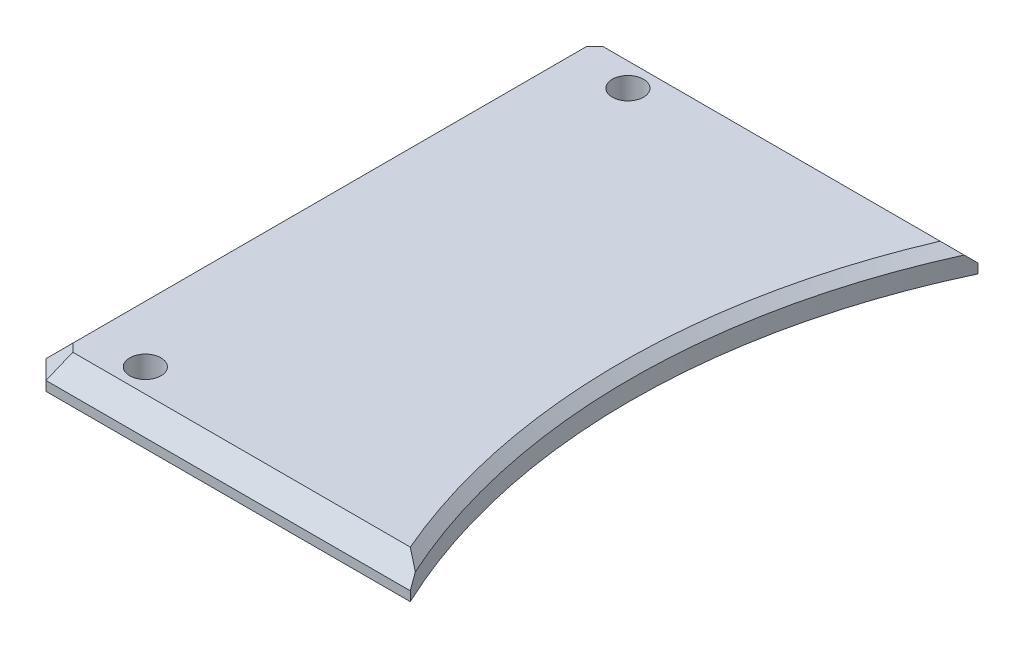
ISO-10303-21;
HEADER;
FILE_DESCRIPTION(('STEP AP214'),'2;1');
FILE_NAME('part.step','',(''),(''),'','','');
FILE_SCHEMA(('AUTOMOTIVE_DESIGN { 1 0 10303 214 1 1 1 1 }'));
ENDSEC;
DATA;
#1=APPLICATION_CONTEXT('core data for automotive mechanical design processes');
#2=APPLICATION_PROTOCOL_DEFINITION('international standard','automotive_design',2000,#1);
#3=PRODUCT_CONTEXT('',#1,'mechanical');
#4=PRODUCT('Part','Part','',(#3));
#5=PRODUCT_RELATED_PRODUCT_CATEGORY('part','',(#4));
#6=PRODUCT_DEFINITION_FORMATION('','',#4);
#7=PRODUCT_DEFINITION_CONTEXT('part definition',#1,'design');
#8=PRODUCT_DEFINITION('design','',#6,#7);
#9=PRODUCT_DEFINITION_SHAPE('','',#8);
#10=(LENGTH_UNIT() NAMED_UNIT(*) SI_UNIT(.MILLI.,.METRE.));
#11=(NAMED_UNIT(*) PLANE_ANGLE_UNIT() SI_UNIT($,.RADIAN.));
#12=(NAMED_UNIT(*) SI_UNIT($,.STERADIAN.) SOLID_ANGLE_UNIT());
#13=UNCERTAINTY_MEASURE_WITH_UNIT(LENGTH_MEASURE(1.E-05),#10,'distance_accuracy_value','');
#14=(GEOMETRIC_REPRESENTATION_CONTEXT(3) GLOBAL_UNCERTAINTY_ASSIGNED_CONTEXT((#13)) GLOBAL_UNIT_ASSIGNED_CONTEXT((#10,
#11,#12)) REPRESENTATION_CONTEXT('',''));
#15=CARTESIAN_POINT('',(0.,0.,0.));
#16=DIRECTION('',(0.,0.,1.));
#17=DIRECTION('',(1.,0.,0.));
#18=AXIS2_PLACEMENT_3D('',#15,#16,#17);
#19=CARTESIAN_POINT('',(83.4955532033676,-3.,0.));
#20=DIRECTION('',(0.,1.,0.));
#21=DIRECTION('',(0.,0.,1.));
#22=AXIS2_PLACEMENT_3D('',#19,#20,#21);
#23=CYLINDRICAL_SURFACE('',#22,70.);
#24=CARTESIAN_POINT('',(83.4955532033676,28.0000000000001,0.));
#25=DIRECTION('',(0.,-0.707106781186546,0.707106781186549));
#26=DIRECTION('',(0.,0.707106781186549,0.707106781186546));
#27=AXIS2_PLACEMENT_3D('',#24,#25,#26);
#28=ELLIPSE('',#27,98.9949493661168,70.);
#29=CARTESIAN_POINT('',(20.25,-2.00000000000001,-30.));
#30=VERTEX_POINT('',#29);
#31=CARTESIAN_POINT('',(19.7852714585817,-1.00000000000001,-29.));
#32=VERTEX_POINT('',#31);
#33=EDGE_CURVE('E174',#30,#32,#28,.F.);
#34=ORIENTED_EDGE('',*,*,#33,.T.);
#35=CARTESIAN_POINT('',(83.4955532033676,-1.,0.));
#36=DIRECTION('',(0.,1.,0.));
#37=DIRECTION('',(0.,0.,1.));
#38=AXIS2_PLACEMENT_3D('',#35,#36,#37);
#39=CIRCLE('',#38,70.);
#40=CARTESIAN_POINT('',(19.7852714585817,-1.,29.));
#41=VERTEX_POINT('',#40);
#42=EDGE_CURVE('E45',#32,#41,#39,.T.);
#43=ORIENTED_EDGE('',*,*,#42,.T.);
#44=CARTESIAN_POINT('',(83.4955532033676,28.0000000000001,0.));
#45=DIRECTION('',(0.,-0.707106781186546,-0.707106781186549));
#46=DIRECTION('',(0.,0.707106781186549,-0.707106781186546));
#47=AXIS2_PLACEMENT_3D('',#44,#45,#46);
#48=ELLIPSE('',#47,98.9949493661168,70.);
#49=CARTESIAN_POINT('',(20.25,-2.00000000000001,30.));
#50=VERTEX_POINT('',#49);
#51=EDGE_CURVE('E172',#41,#50,#48,.F.);
#52=ORIENTED_EDGE('',*,*,#51,.T.);
#53=DIRECTION('',(0.,1.,0.));
#54=VECTOR('',#53,1.);
#55=CARTESIAN_POINT('',(20.25,-3.,30.));
#56=LINE('',#55,#54);
#57=CARTESIAN_POINT('',(20.25,-3.,30.));
#58=VERTEX_POINT('',#57);
#59=EDGE_CURVE('E122',#58,#50,#56,.T.);
#60=ORIENTED_EDGE('',*,*,#59,.F.);
#61=CARTESIAN_POINT('',(83.4955532033676,-3.,0.));
#62=DIRECTION('',(0.,-1.,0.));
#63=DIRECTION('',(0.,0.,1.));
#64=AXIS2_PLACEMENT_3D('',#61,#62,#63);
#65=CIRCLE('',#64,70.);
#66=CARTESIAN_POINT('',(20.25,-3.,-30.));
#67=VERTEX_POINT('',#66);
#68=EDGE_CURVE('E129',#58,#67,#65,.T.);
#69=ORIENTED_EDGE('',*,*,#68,.T.);
#70=DIRECTION('',(0.,1.,0.));
#71=VECTOR('',#70,1.);
#72=CARTESIAN_POINT('',(20.25,-3.,-30.));
#73=LINE('',#72,#71);
#74=EDGE_CURVE('E113',#67,#30,#73,.T.);
#75=ORIENTED_EDGE('',*,*,#74,.T.);
#76=EDGE_LOOP('',(#34,#43,#52,#60,#69,#75));
#77=FACE_BOUND('',#76,.T.);
#78=ADVANCED_FACE('F33',(#77),#23,.F.);
#79=CARTESIAN_POINT('',(-20.25,-3.,30.));
#80=DIRECTION('',(0.,0.,1.));
#81=DIRECTION('',(1.,0.,0.));
#82=AXIS2_PLACEMENT_3D('',#79,#80,#81);
#83=PLANE('',#82);
#84=ORIENTED_EDGE('',*,*,#59,.T.);
#85=DIRECTION('',(-1.,0.,0.));
#86=VECTOR('',#85,1.);
#87=CARTESIAN_POINT('',(-20.25,-2.00000000000001,30.));
#88=LINE('',#87,#86);
#89=CARTESIAN_POINT('',(-18.25,-2.00000000000001,30.));
#90=VERTEX_POINT('',#89);
#91=EDGE_CURVE('E178',#50,#90,#88,.T.);
#92=ORIENTED_EDGE('',*,*,#91,.T.);
#93=DIRECTION('',(0.,-1.,0.));
#94=VECTOR('',#93,1.);
#95=CARTESIAN_POINT('',(-18.25,-3.,30.));
#96=LINE('',#95,#94);
#97=CARTESIAN_POINT('',(-18.25,-3.,30.));
#98=VERTEX_POINT('',#97);
#99=EDGE_CURVE('E153',#90,#98,#96,.T.);
#100=ORIENTED_EDGE('',*,*,#99,.T.);
#101=DIRECTION('',(1.,0.,0.));
#102=VECTOR('',#101,1.);
#103=CARTESIAN_POINT('',(-20.25,-3.,30.));
#104=LINE('',#103,#102);
#105=EDGE_CURVE('E123',#98,#58,#104,.T.);
#106=ORIENTED_EDGE('',*,*,#105,.T.);
#107=EDGE_LOOP('',(#84,#92,#100,#106));
#108=FACE_BOUND('',#107,.T.);
#109=ADVANCED_FACE('F232',(#108),#83,.T.);
#110=CARTESIAN_POINT('',(-20.25,-3.,30.));
#111=DIRECTION('',(-1.,0.,0.));
#112=DIRECTION('',(0.,0.,1.));
#113=AXIS2_PLACEMENT_3D('',#110,#111,#112);
#114=PLANE('',#113);
#115=DIRECTION('',(0.,1.,0.));
#116=VECTOR('',#115,1.);
#117=CARTESIAN_POINT('',(-20.25,-3.,28.));
#118=LINE('',#117,#116);
#119=CARTESIAN_POINT('',(-20.25,-3.,28.));
#120=VERTEX_POINT('',#119);
#121=CARTESIAN_POINT('',(-20.25,-2.00000000000001,28.));
#122=VERTEX_POINT('',#121);
#123=EDGE_CURVE('E150',#120,#122,#118,.T.);
#124=ORIENTED_EDGE('',*,*,#123,.T.);
#125=DIRECTION('',(0.,0.,-1.));
#126=VECTOR('',#125,1.);
#127=CARTESIAN_POINT('',(-20.25,-2.00000000000001,30.));
#128=LINE('',#127,#126);
#129=CARTESIAN_POINT('',(-20.25,-2.00000000000001,-28.));
#130=VERTEX_POINT('',#129);
#131=EDGE_CURVE('E182',#122,#130,#128,.T.);
#132=ORIENTED_EDGE('',*,*,#131,.T.);
#133=DIRECTION('',(0.,-1.,0.));
#134=VECTOR('',#133,1.);
#135=CARTESIAN_POINT('',(-20.25,-3.,-28.));
#136=LINE('',#135,#134);
#137=CARTESIAN_POINT('',(-20.25,-3.,-28.));
#138=VERTEX_POINT('',#137);
#139=EDGE_CURVE('E147',#130,#138,#136,.T.);
#140=ORIENTED_EDGE('',*,*,#139,.T.);
#141=DIRECTION('',(0.,0.,1.));
#142=VECTOR('',#141,1.);
#143=CARTESIAN_POINT('',(-20.25,-3.,30.));
#144=LINE('',#143,#142);
#145=EDGE_CURVE('E133',#138,#120,#144,.T.);
#146=ORIENTED_EDGE('',*,*,#145,.T.);
#147=EDGE_LOOP('',(#124,#132,#140,#146));
#148=FACE_BOUND('',#147,.T.);
#149=ADVANCED_FACE('F239',(#148),#114,.T.);
#150=CARTESIAN_POINT('',(-20.25,-3.,-30.));
#151=DIRECTION('',(0.,0.,-1.));
#152=DIRECTION('',(-1.,0.,0.));
#153=AXIS2_PLACEMENT_3D('',#150,#151,#152);
#154=PLANE('',#153);
#155=DIRECTION('',(0.,1.,0.));
#156=VECTOR('',#155,1.);
#157=CARTESIAN_POINT('',(-18.25,-3.,-30.));
#158=LINE('',#157,#156);
#159=CARTESIAN_POINT('',(-18.25,-3.,-30.));
#160=VERTEX_POINT('',#159);
#161=CARTESIAN_POINT('',(-18.25,-2.00000000000001,-30.));
#162=VERTEX_POINT('',#161);
#163=EDGE_CURVE('E158',#160,#162,#158,.T.);
#164=ORIENTED_EDGE('',*,*,#163,.T.);
#165=DIRECTION('',(1.,0.,0.));
#166=VECTOR('',#165,1.);
#167=CARTESIAN_POINT('',(-20.25,-2.00000000000001,-30.));
#168=LINE('',#167,#166);
#169=EDGE_CURVE('E120',#162,#30,#168,.T.);
#170=ORIENTED_EDGE('',*,*,#169,.T.);
#171=ORIENTED_EDGE('',*,*,#74,.F.);
#172=DIRECTION('',(-1.,0.,0.));
#173=VECTOR('',#172,1.);
#174=CARTESIAN_POINT('',(-20.25,-3.,-30.));
#175=LINE('',#174,#173);
#176=EDGE_CURVE('E117',#67,#160,#175,.T.);
#177=ORIENTED_EDGE('',*,*,#176,.T.);
#178=EDGE_LOOP('',(#164,#170,#171,#177));
#179=FACE_BOUND('',#178,.T.);
#180=ADVANCED_FACE('F116',(#179),#154,.T.);
#181=CARTESIAN_POINT('',(83.4955532033676,-3.,0.));
#182=DIRECTION('',(0.,1.,0.));
#183=DIRECTION('',(0.,0.,1.));
#184=AXIS2_PLACEMENT_3D('',#181,#182,#183);
#185=PLANE('',#184);
#186=CARTESIAN_POINT('',(-12.25,-3.,-25.5));
#187=DIRECTION('',(0.,1.,0.));
#188=DIRECTION('',(0.,0.,1.));
#189=AXIS2_PLACEMENT_3D('',#186,#187,#188);
#190=CIRCLE('',#189,1.65);
#191=CARTESIAN_POINT('',(-12.25,-3.,-23.85));
#192=VERTEX_POINT('',#191);
#193=EDGE_CURVE('E372',#192,#192,#190,.T.);
#194=ORIENTED_EDGE('',*,*,#193,.T.);
#195=EDGE_LOOP('',(#194));
#196=FACE_BOUND('',#195,.T.);
#197=CARTESIAN_POINT('',(-12.25,-3.,25.5));
#198=DIRECTION('',(0.,1.,0.));
#199=DIRECTION('',(0.,0.,1.));
#200=AXIS2_PLACEMENT_3D('',#197,#198,#199);
#201=CIRCLE('',#200,1.65);
#202=CARTESIAN_POINT('',(-12.25,-3.,27.15));
#203=VERTEX_POINT('',#202);
#204=EDGE_CURVE('E137',#203,#203,#201,.T.);
#205=ORIENTED_EDGE('',*,*,#204,.T.);
#206=EDGE_LOOP('',(#205));
#207=FACE_BOUND('',#206,.T.);
#208=ORIENTED_EDGE('',*,*,#105,.F.);
#209=DIRECTION('',(0.70710678118655,0.,0.707106781186545));
#210=VECTOR('',#209,1.);
#211=CARTESIAN_POINT('',(-20.25,-3.,28.));
#212=LINE('',#211,#210);
#213=EDGE_CURVE('E156',#98,#120,#212,.F.);
#214=ORIENTED_EDGE('',*,*,#213,.T.);
#215=ORIENTED_EDGE('',*,*,#145,.F.);
#216=DIRECTION('',(-0.707106781186546,0.,0.707106781186549));
#217=VECTOR('',#216,1.);
#218=CARTESIAN_POINT('',(-18.25,-3.,-30.));
#219=LINE('',#218,#217);
#220=EDGE_CURVE('E132',#138,#160,#219,.F.);
#221=ORIENTED_EDGE('',*,*,#220,.T.);
#222=ORIENTED_EDGE('',*,*,#176,.F.);
#223=ORIENTED_EDGE('',*,*,#68,.F.);
#224=EDGE_LOOP('',(#208,#214,#215,#221,#222,#223));
#225=FACE_BOUND('',#224,.T.);
#226=ADVANCED_FACE('F128',(#196,#207,#225),#185,.F.);
#227=CARTESIAN_POINT('',(83.4955532033676,0.,0.));
#228=DIRECTION('',(0.,1.,0.));
#229=DIRECTION('',(0.,0.,1.));
#230=AXIS2_PLACEMENT_3D('',#227,#228,#229);
#231=PLANE('',#230);
#232=DIRECTION('',(1.,0.,0.));
#233=VECTOR('',#232,1.);
#234=CARTESIAN_POINT('',(83.4955532033676,0.,28.));
#235=LINE('',#234,#233);
#236=CARTESIAN_POINT('',(-17.4215728752538,0.,28.));
#237=VERTEX_POINT('',#236);
#238=CARTESIAN_POINT('',(18.249863690573,0.,28.));
#239=VERTEX_POINT('',#238);
#240=EDGE_CURVE('E164',#237,#239,#235,.T.);
#241=ORIENTED_EDGE('',*,*,#240,.T.);
#242=CARTESIAN_POINT('',(83.4955532033676,0.,0.));
#243=DIRECTION('',(0.,1.,0.));
#244=DIRECTION('',(0.,0.,1.));
#245=AXIS2_PLACEMENT_3D('',#242,#243,#244);
#246=CIRCLE('',#245,71.);
#247=CARTESIAN_POINT('',(18.249863690573,0.,-28.));
#248=VERTEX_POINT('',#247);
#249=EDGE_CURVE('E184',#239,#248,#246,.F.);
#250=ORIENTED_EDGE('',*,*,#249,.T.);
#251=DIRECTION('',(-1.,0.,0.));
#252=VECTOR('',#251,1.);
#253=CARTESIAN_POINT('',(83.4955532033676,0.,-28.));
#254=LINE('',#253,#252);
#255=CARTESIAN_POINT('',(-17.4215728752538,0.,-28.));
#256=VERTEX_POINT('',#255);
#257=EDGE_CURVE('E169',#248,#256,#254,.T.);
#258=ORIENTED_EDGE('',*,*,#257,.T.);
#259=DIRECTION('',(-0.707106781186546,0.,0.707106781186549));
#260=VECTOR('',#259,1.);
#261=CARTESIAN_POINT('',(19.0369901640567,0.,-64.4585630393107));
#262=LINE('',#261,#260);
#263=CARTESIAN_POINT('',(-18.25,0.,-27.1715728752538));
#264=VERTEX_POINT('',#263);
#265=EDGE_CURVE('E167',#256,#264,#262,.T.);
#266=ORIENTED_EDGE('',*,*,#265,.T.);
#267=DIRECTION('',(0.,0.,1.));
#268=VECTOR('',#267,1.);
#269=CARTESIAN_POINT('',(-18.25,0.,0.));
#270=LINE('',#269,#268);
#271=CARTESIAN_POINT('',(-18.25,0.,27.1715728752538));
#272=VERTEX_POINT('',#271);
#273=EDGE_CURVE('E160',#264,#272,#270,.T.);
#274=ORIENTED_EDGE('',*,*,#273,.T.);
#275=DIRECTION('',(0.70710678118655,0.,0.707106781186545));
#276=VECTOR('',#275,1.);
#277=CARTESIAN_POINT('',(19.0369901640572,0.,64.4585630393108));
#278=LINE('',#277,#276);
#279=EDGE_CURVE('E162',#272,#237,#278,.T.);
#280=ORIENTED_EDGE('',*,*,#279,.T.);
#281=EDGE_LOOP('',(#241,#250,#258,#266,#274,#280));
#282=FACE_BOUND('',#281,.T.);
#283=CARTESIAN_POINT('',(-12.25,0.,-25.5));
#284=DIRECTION('',(0.,1.,0.));
#285=DIRECTION('',(0.,0.,1.));
#286=AXIS2_PLACEMENT_3D('',#283,#284,#285);
#287=CIRCLE('',#286,1.65);
#288=CARTESIAN_POINT('',(-12.25,0.,-23.85));
#289=VERTEX_POINT('',#288);
#290=EDGE_CURVE('E197',#289,#289,#287,.T.);
#291=ORIENTED_EDGE('',*,*,#290,.F.);
#292=EDGE_LOOP('',(#291));
#293=FACE_BOUND('',#292,.T.);
#294=CARTESIAN_POINT('',(-12.25,0.,25.5));
#295=DIRECTION('',(0.,1.,0.));
#296=DIRECTION('',(0.,0.,1.));
#297=AXIS2_PLACEMENT_3D('',#294,#295,#296);
#298=CIRCLE('',#297,1.65);
#299=CARTESIAN_POINT('',(-12.25,0.,27.15));
#300=VERTEX_POINT('',#299);
#301=EDGE_CURVE('E140',#300,#300,#298,.T.);
#302=ORIENTED_EDGE('',*,*,#301,.F.);
#303=EDGE_LOOP('',(#302));
#304=FACE_BOUND('',#303,.T.);
#305=ADVANCED_FACE('F271',(#282,#293,#304),#231,.T.);
#306=CARTESIAN_POINT('',(-12.25,-3.,25.5));
#307=DIRECTION('',(0.,1.,0.));
#308=DIRECTION('',(0.,0.,1.));
#309=AXIS2_PLACEMENT_3D('',#306,#307,#308);
#310=CYLINDRICAL_SURFACE('',#309,1.65);
#311=ORIENTED_EDGE('',*,*,#204,.F.);
#312=EDGE_LOOP('',(#311));
#313=FACE_BOUND('',#312,.T.);
#314=ORIENTED_EDGE('',*,*,#301,.T.);
#315=EDGE_LOOP('',(#314));
#316=FACE_BOUND('',#315,.T.);
#317=ADVANCED_FACE('F250',(#313,#316),#310,.F.);
#318=CARTESIAN_POINT('',(-12.25,-3.,-25.5));
#319=DIRECTION('',(0.,1.,0.));
#320=DIRECTION('',(0.,0.,1.));
#321=AXIS2_PLACEMENT_3D('',#318,#319,#320);
#322=CYLINDRICAL_SURFACE('',#321,1.65);
#323=ORIENTED_EDGE('',*,*,#193,.F.);
#324=EDGE_LOOP('',(#323));
#325=FACE_BOUND('',#324,.T.);
#326=ORIENTED_EDGE('',*,*,#290,.T.);
#327=EDGE_LOOP('',(#326));
#328=FACE_BOUND('',#327,.T.);
#329=ADVANCED_FACE('F245',(#325,#328),#322,.F.);
#330=CARTESIAN_POINT('',(-20.25,-3.,28.));
#331=DIRECTION('',(0.707106781186545,0.,-0.70710678118655));
#332=DIRECTION('',(0.,1.,0.));
#333=AXIS2_PLACEMENT_3D('',#330,#331,#332);
#334=PLANE('',#333);
#335=ORIENTED_EDGE('',*,*,#99,.F.);
#336=DIRECTION('',(0.70710678118655,0.,0.707106781186545));
#337=VECTOR('',#336,1.);
#338=CARTESIAN_POINT('',(-20.25,-2.,28.));
#339=LINE('',#338,#337);
#340=EDGE_CURVE('E180',#90,#122,#339,.F.);
#341=ORIENTED_EDGE('',*,*,#340,.T.);
#342=ORIENTED_EDGE('',*,*,#123,.F.);
#343=ORIENTED_EDGE('',*,*,#213,.F.);
#344=EDGE_LOOP('',(#335,#341,#342,#343));
#345=FACE_BOUND('',#344,.T.);
#346=ADVANCED_FACE('F229',(#345),#334,.F.);
#347=CARTESIAN_POINT('',(-18.25,-3.,-30.));
#348=DIRECTION('',(0.707106781186549,0.,0.707106781186546));
#349=DIRECTION('',(0.,1.,0.));
#350=AXIS2_PLACEMENT_3D('',#347,#348,#349);
#351=PLANE('',#350);
#352=ORIENTED_EDGE('',*,*,#139,.F.);
#353=DIRECTION('',(-0.707106781186546,0.,0.707106781186549));
#354=VECTOR('',#353,1.);
#355=CARTESIAN_POINT('',(-18.25,-2.00000000000001,-30.));
#356=LINE('',#355,#354);
#357=EDGE_CURVE('E176',#130,#162,#356,.F.);
#358=ORIENTED_EDGE('',*,*,#357,.T.);
#359=ORIENTED_EDGE('',*,*,#163,.F.);
#360=ORIENTED_EDGE('',*,*,#220,.F.);
#361=EDGE_LOOP('',(#352,#358,#359,#360));
#362=FACE_BOUND('',#361,.T.);
#363=ADVANCED_FACE('F210',(#362),#351,.F.);
#364=CARTESIAN_POINT('',(83.4955532033676,0.,28.));
#365=DIRECTION('',(0.,-0.707106781186546,-0.707106781186549));
#366=DIRECTION('',(1.,0.,0.));
#367=AXIS2_PLACEMENT_3D('',#364,#365,#366);
#368=PLANE('',#367);
#369=ORIENTED_EDGE('',*,*,#51,.F.);
#370=CARTESIAN_POINT('',(19.7852714585817,-1.,29.));
#371=CARTESIAN_POINT('',(19.5279716995768,-0.834406917170545,28.8344069171705));
#372=CARTESIAN_POINT('',(19.2713711647976,-0.668277037187494,28.6682770371875));
#373=CARTESIAN_POINT('',(18.7595685756359,-0.334943703720139,28.3349437037201));
#374=CARTESIAN_POINT('',(18.5043665210789,-0.167740250369857,28.1677402503698));
#375=CARTESIAN_POINT('',(18.249863690573,0.,28.));
#376=B_SPLINE_CURVE_WITH_KNOTS('',3,(#370,#371,#372,#373,#374,#375),.UNSPECIFIED.,.F.,.F.,(4,2,
4),(0.,1.04373319218,2.08746625406493),.UNSPECIFIED.);
#377=EDGE_CURVE('E11',#41,#239,#376,.T.);
#378=ORIENTED_EDGE('',*,*,#377,.T.);
#379=ORIENTED_EDGE('',*,*,#240,.F.);
#380=DIRECTION('',(-0.281084637714812,-0.67859834454585,0.678598344545847));
#381=VECTOR('',#380,1.);
#382=CARTESIAN_POINT('',(-21.4952702805072,-9.83477552476709,37.834775524767));
#383=LINE('',#382,#381);
#384=EDGE_CURVE('E194',#90,#237,#383,.F.);
#385=ORIENTED_EDGE('',*,*,#384,.F.);
#386=ORIENTED_EDGE('',*,*,#91,.F.);
#387=EDGE_LOOP('',(#369,#378,#379,#385,#386));
#388=FACE_BOUND('',#387,.T.);
#389=ADVANCED_FACE('F221',(#388),#368,.F.);
#390=CARTESIAN_POINT('',(19.0369901640572,0.,64.4585630393108));
#391=DIRECTION('',(-0.500000000000001,0.707106781186544,0.500000000000004));
#392=DIRECTION('',(-0.70710678118655,0.,-0.707106781186545));
#393=AXIS2_PLACEMENT_3D('',#390,#391,#392);
#394=PLANE('',#393);
#395=ORIENTED_EDGE('',*,*,#384,.T.);
#396=ORIENTED_EDGE('',*,*,#279,.F.);
#397=DIRECTION('',(-0.678598344545845,-0.67859834454585,0.281084637714817));
#398=VECTOR('',#397,1.);
#399=CARTESIAN_POINT('',(-13.0671971918633,5.18280280813672,25.0247856610183));
#400=LINE('',#399,#398);
#401=EDGE_CURVE('E191',#122,#272,#400,.F.);
#402=ORIENTED_EDGE('',*,*,#401,.F.);
#403=ORIENTED_EDGE('',*,*,#340,.F.);
#404=EDGE_LOOP('',(#395,#396,#402,#403));
#405=FACE_BOUND('',#404,.T.);
#406=ADVANCED_FACE('F218',(#405),#394,.T.);
#407=CARTESIAN_POINT('',(-18.25,0.,0.));
#408=DIRECTION('',(0.70710678118655,-0.707106781186545,0.));
#409=DIRECTION('',(0.,0.,1.));
#410=AXIS2_PLACEMENT_3D('',#407,#408,#409);
#411=PLANE('',#410);
#412=ORIENTED_EDGE('',*,*,#401,.T.);
#413=ORIENTED_EDGE('',*,*,#273,.F.);
#414=DIRECTION('',(0.678598344545845,0.67859834454585,0.281084637714819));
#415=VECTOR('',#414,1.);
#416=CARTESIAN_POINT('',(-13.0671971918633,5.18280280813674,-25.0247856610182));
#417=LINE('',#416,#415);
#418=EDGE_CURVE('E188',#130,#264,#417,.T.);
#419=ORIENTED_EDGE('',*,*,#418,.F.);
#420=ORIENTED_EDGE('',*,*,#131,.F.);
#421=EDGE_LOOP('',(#412,#413,#419,#420));
#422=FACE_BOUND('',#421,.T.);
#423=ADVANCED_FACE('F214',(#422),#411,.F.);
#424=CARTESIAN_POINT('',(19.0369901640567,0.,-64.4585630393107));
#425=DIRECTION('',(-0.500000000000003,0.707106781186545,-0.500000000000001));
#426=DIRECTION('',(0.707106781186546,0.,-0.707106781186549));
#427=AXIS2_PLACEMENT_3D('',#424,#425,#426);
#428=PLANE('',#427);
#429=ORIENTED_EDGE('',*,*,#418,.T.);
#430=ORIENTED_EDGE('',*,*,#265,.F.);
#431=DIRECTION('',(0.281084637714817,0.678598344545849,0.678598344545846));
#432=VECTOR('',#431,1.);
#433=CARTESIAN_POINT('',(-21.4952702805072,-9.83477552476695,-37.8347755247669));
#434=LINE('',#433,#432);
#435=EDGE_CURVE('E185',#162,#256,#434,.T.);
#436=ORIENTED_EDGE('',*,*,#435,.F.);
#437=ORIENTED_EDGE('',*,*,#357,.F.);
#438=EDGE_LOOP('',(#429,#430,#436,#437));
#439=FACE_BOUND('',#438,.T.);
#440=ADVANCED_FACE('F209',(#439),#428,.T.);
#441=CARTESIAN_POINT('',(83.4955532033676,0.,-28.));
#442=DIRECTION('',(0.,-0.707106781186546,0.707106781186549));
#443=DIRECTION('',(-1.,0.,0.));
#444=AXIS2_PLACEMENT_3D('',#441,#442,#443);
#445=PLANE('',#444);
#446=ORIENTED_EDGE('',*,*,#257,.F.);
#447=CARTESIAN_POINT('',(18.249863690573,0.,-28.));
#448=CARTESIAN_POINT('',(18.5043665210789,-0.167740250369855,-28.1677402503699));
#449=CARTESIAN_POINT('',(18.7595685756359,-0.334943703720138,-28.3349437037201));
#450=CARTESIAN_POINT('',(19.2713711647976,-0.668277037187495,-28.6682770371875));
#451=CARTESIAN_POINT('',(19.5279716995768,-0.834406917170546,-28.8344069171706));
#452=CARTESIAN_POINT('',(19.7852714585817,-1.,-29.));
#453=B_SPLINE_CURVE_WITH_KNOTS('',3,(#447,#448,#449,#450,#451,#452),.UNSPECIFIED.,.F.,.F.,(4,2,
4),(0.,1.04373306188493,2.08746625406493),.UNSPECIFIED.);
#454=EDGE_CURVE('E59',#248,#32,#453,.T.);
#455=ORIENTED_EDGE('',*,*,#454,.T.);
#456=ORIENTED_EDGE('',*,*,#33,.F.);
#457=ORIENTED_EDGE('',*,*,#169,.F.);
#458=ORIENTED_EDGE('',*,*,#435,.T.);
#459=EDGE_LOOP('',(#446,#455,#456,#457,#458));
#460=FACE_BOUND('',#459,.T.);
#461=ADVANCED_FACE('F204',(#460),#445,.F.);
#462=CARTESIAN_POINT('',(83.4955532033676,0.,0.));
#463=DIRECTION('',(0.,1.,0.));
#464=DIRECTION('',(0.,0.,1.));
#465=AXIS2_PLACEMENT_3D('',#462,#463,#464);
#466=CONICAL_SURFACE('',#465,71.,0.785398163397441);
#467=ORIENTED_EDGE('',*,*,#377,.F.);
#468=ORIENTED_EDGE('',*,*,#42,.F.);
#469=ORIENTED_EDGE('',*,*,#454,.F.);
#470=ORIENTED_EDGE('',*,*,#249,.F.);
#471=EDGE_LOOP('',(#467,#468,#469,#470));
#472=FACE_BOUND('',#471,.T.);
#473=ADVANCED_FACE('F35',(#472),#466,.F.);
#474=CLOSED_SHELL('',(#78,#109,#149,#180,#226,#305,#317,#329,#346,#363,#389,#406,#423,#440,#461,#473));
#475=MANIFOLD_SOLID_BREP('B2',#474);
#476=ADVANCED_BREP_SHAPE_REPRESENTATION('',(#18,#475),#14);
#477=SHAPE_DEFINITION_REPRESENTATION(#9,#476);
ENDSEC;
END-ISO-10303-21;
